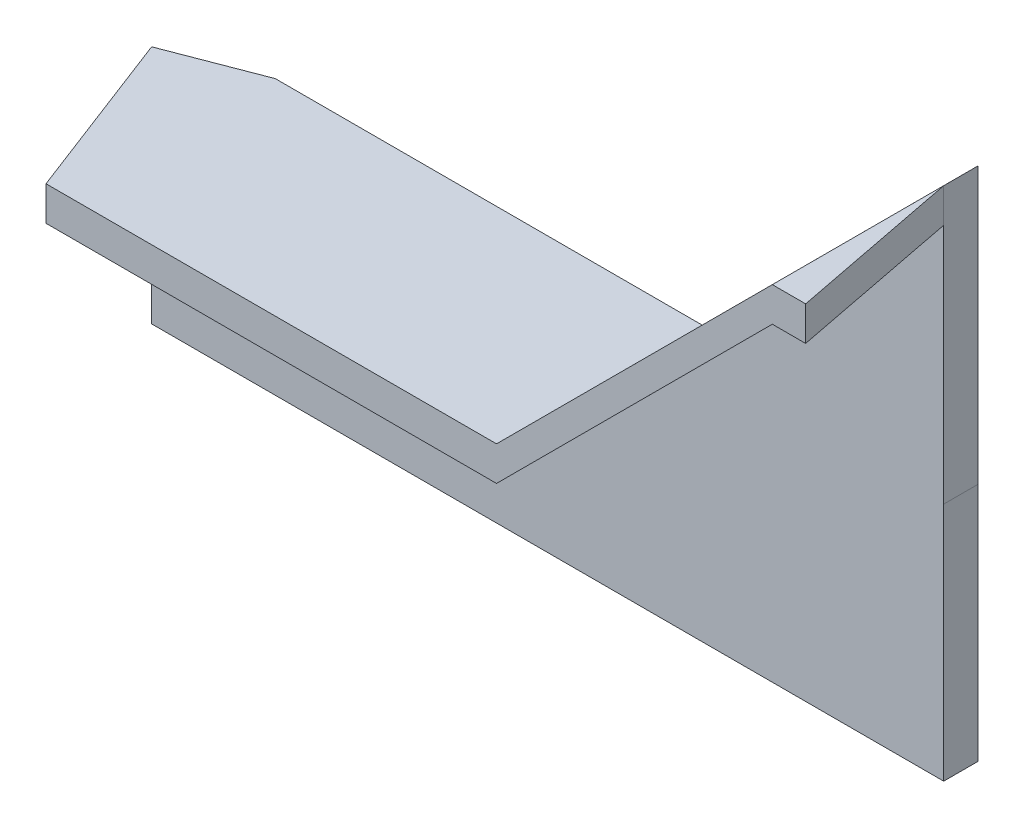
ISO-10303-21;
HEADER;
FILE_DESCRIPTION(('STEP AP214'),'2;1');
FILE_NAME('part.step','',(''),(''),'','','');
FILE_SCHEMA(('AUTOMOTIVE_DESIGN { 1 0 10303 214 1 1 1 1 }'));
ENDSEC;
DATA;
#1=APPLICATION_CONTEXT('core data for automotive mechanical design processes');
#2=APPLICATION_PROTOCOL_DEFINITION('international standard','automotive_design',2000,#1);
#3=PRODUCT_CONTEXT('',#1,'mechanical');
#4=PRODUCT('Part','Part','',(#3));
#5=PRODUCT_RELATED_PRODUCT_CATEGORY('part','',(#4));
#6=PRODUCT_DEFINITION_FORMATION('','',#4);
#7=PRODUCT_DEFINITION_CONTEXT('part definition',#1,'design');
#8=PRODUCT_DEFINITION('design','',#6,#7);
#9=PRODUCT_DEFINITION_SHAPE('','',#8);
#10=(LENGTH_UNIT() NAMED_UNIT(*) SI_UNIT(.MILLI.,.METRE.));
#11=(NAMED_UNIT(*) PLANE_ANGLE_UNIT() SI_UNIT($,.RADIAN.));
#12=(NAMED_UNIT(*) SI_UNIT($,.STERADIAN.) SOLID_ANGLE_UNIT());
#13=UNCERTAINTY_MEASURE_WITH_UNIT(LENGTH_MEASURE(1.E-05),#10,'distance_accuracy_value','');
#14=(GEOMETRIC_REPRESENTATION_CONTEXT(3) GLOBAL_UNCERTAINTY_ASSIGNED_CONTEXT((#13)) GLOBAL_UNIT_ASSIGNED_CONTEXT((#10,
#11,#12)) REPRESENTATION_CONTEXT('',''));
#15=CARTESIAN_POINT('',(0.,0.,0.));
#16=DIRECTION('',(0.,0.,1.));
#17=DIRECTION('',(1.,0.,0.));
#18=AXIS2_PLACEMENT_3D('',#15,#16,#17);
#19=CARTESIAN_POINT('',(0.,0.,2.));
#20=DIRECTION('',(0.,0.,1.));
#21=DIRECTION('',(1.,0.,0.));
#22=AXIS2_PLACEMENT_3D('',#19,#20,#21);
#23=PLANE('',#22);
#24=DIRECTION('',(3.40150407365471E-05,0.999999999421489,0.));
#25=VECTOR('',#24,1.);
#26=CARTESIAN_POINT('',(22.8216855133879,22.4355284552846,2.));
#27=LINE('',#26,#25);
#28=CARTESIAN_POINT('',(22.8211382113821,6.34552845528455,2.));
#29=VERTEX_POINT('',#28);
#30=CARTESIAN_POINT('',(22.8214976653253,20.4355284564416,2.0018487571625));
#31=VERTEX_POINT('',#30);
#32=EDGE_CURVE('E243',#29,#31,#27,.T.);
#33=ORIENTED_EDGE('',*,*,#32,.T.);
#34=DIRECTION('',(0.707105286298341,0.707108276071594,0.));
#35=VECTOR('',#34,1.);
#36=CARTESIAN_POINT('',(6.73168551338772,4.34552845528455,2.));
#37=LINE('',#36,#35);
#38=CARTESIAN_POINT('',(6.73168551338772,4.34552845528455,2.));
#39=VERTEX_POINT('',#38);
#40=EDGE_CURVE('E232',#39,#31,#37,.T.);
#41=ORIENTED_EDGE('',*,*,#40,.F.);
#42=DIRECTION('',(1.,0.,0.));
#43=VECTOR('',#42,1.);
#44=CARTESIAN_POINT('',(-46.1788617886179,4.34552845528455,2.));
#45=LINE('',#44,#43);
#46=CARTESIAN_POINT('',(-23.3890399180056,4.34552845528455,2.));
#47=VERTEX_POINT('',#46);
#48=EDGE_CURVE('E222',#47,#39,#45,.T.);
#49=ORIENTED_EDGE('',*,*,#48,.F.);
#50=DIRECTION('',(0.,-1.,0.));
#51=VECTOR('',#50,1.);
#52=CARTESIAN_POINT('',(-23.3890399180056,0.,2.));
#53=LINE('',#52,#51);
#54=CARTESIAN_POINT('',(-23.3890399180056,-7.65447154471545,2.));
#55=VERTEX_POINT('',#54);
#56=EDGE_CURVE('E229',#47,#55,#53,.T.);
#57=ORIENTED_EDGE('',*,*,#56,.T.);
#58=DIRECTION('',(1.,0.,0.));
#59=VECTOR('',#58,1.);
#60=CARTESIAN_POINT('',(-46.1788617886179,-7.65447154471545,2.));
#61=LINE('',#60,#59);
#62=CARTESIAN_POINT('',(22.8211382113821,-7.65447154471545,2.));
#63=VERTEX_POINT('',#62);
#64=EDGE_CURVE('E227',#55,#63,#61,.T.);
#65=ORIENTED_EDGE('',*,*,#64,.T.);
#66=DIRECTION('',(0.,1.,0.));
#67=VECTOR('',#66,1.);
#68=CARTESIAN_POINT('',(22.8211382113821,6.34552845528455,2.));
#69=LINE('',#68,#67);
#70=EDGE_CURVE('E225',#63,#29,#69,.T.);
#71=ORIENTED_EDGE('',*,*,#70,.T.);
#72=EDGE_LOOP('',(#33,#41,#49,#57,#65,#71));
#73=FACE_BOUND('',#72,.T.);
#74=ADVANCED_FACE('F51',(#73),#23,.T.);
#75=CARTESIAN_POINT('',(-46.1788617886179,6.34552845528455,2.));
#76=DIRECTION('',(0.,-1.,0.));
#77=DIRECTION('',(0.,0.,-1.));
#78=AXIS2_PLACEMENT_3D('',#75,#76,#77);
#79=PLANE('',#78);
#80=DIRECTION('',(0.933580426497204,0.,-0.358367949545294));
#81=VECTOR('',#80,1.);
#82=CARTESIAN_POINT('',(-43.2520199516604,6.34552845528455,9.62468366354648));
#83=LINE('',#82,#81);
#84=CARTESIAN_POINT('',(-23.3890399180056,6.34552845528455,2.));
#85=VERTEX_POINT('',#84);
#86=CARTESIAN_POINT('',(-18.1788617886179,6.34552845528455,0.));
#87=VERTEX_POINT('',#86);
#88=EDGE_CURVE('E209',#85,#87,#83,.T.);
#89=ORIENTED_EDGE('',*,*,#88,.F.);
#90=DIRECTION('',(0.358239373263557,0.,0.933629772149396));
#91=VECTOR('',#90,1.);
#92=CARTESIAN_POINT('',(-26.313781930288,6.34552845528455,-5.6223509259941));
#93=LINE('',#92,#91);
#94=CARTESIAN_POINT('',(-19.551979619052,6.34552845528455,12.));
#95=VERTEX_POINT('',#94);
#96=EDGE_CURVE('E79',#85,#95,#93,.T.);
#97=ORIENTED_EDGE('',*,*,#96,.T.);
#98=DIRECTION('',(-1.,0.,0.));
#99=VECTOR('',#98,1.);
#100=CARTESIAN_POINT('',(6.73168551338772,6.34552845528455,12.));
#101=LINE('',#100,#99);
#102=CARTESIAN_POINT('',(6.73168551338772,6.34552845528455,12.));
#103=VERTEX_POINT('',#102);
#104=EDGE_CURVE('E251',#103,#95,#101,.T.);
#105=ORIENTED_EDGE('',*,*,#104,.F.);
#106=DIRECTION('',(0.,0.,-1.));
#107=VECTOR('',#106,1.);
#108=CARTESIAN_POINT('',(6.73168551338772,6.34552845528455,6.));
#109=LINE('',#108,#107);
#110=CARTESIAN_POINT('',(6.73168551338772,6.34552845528455,0.));
#111=VERTEX_POINT('',#110);
#112=EDGE_CURVE('E220',#103,#111,#109,.T.);
#113=ORIENTED_EDGE('',*,*,#112,.T.);
#114=DIRECTION('',(-1.,0.,0.));
#115=VECTOR('',#114,1.);
#116=CARTESIAN_POINT('',(-46.1788617886179,6.34552845528455,0.));
#117=LINE('',#116,#115);
#118=EDGE_CURVE('E216',#111,#87,#117,.T.);
#119=ORIENTED_EDGE('',*,*,#118,.T.);
#120=EDGE_LOOP('',(#89,#97,#105,#113,#119));
#121=FACE_BOUND('',#120,.T.);
#122=ADVANCED_FACE('F53',(#121),#79,.F.);
#123=CARTESIAN_POINT('',(-46.1788617886179,-7.65447154471545,2.));
#124=DIRECTION('',(0.,1.,0.));
#125=DIRECTION('',(0.,0.,1.));
#126=AXIS2_PLACEMENT_3D('',#123,#124,#125);
#127=PLANE('',#126);
#128=DIRECTION('',(-0.933580426497204,0.,0.358367949545294));
#129=VECTOR('',#128,1.);
#130=CARTESIAN_POINT('',(-43.2520199516604,-7.65447154471545,9.62468366354648));
#131=LINE('',#130,#129);
#132=CARTESIAN_POINT('',(-18.1788617886179,-7.65447154471545,0.));
#133=VERTEX_POINT('',#132);
#134=EDGE_CURVE('E237',#133,#55,#131,.T.);
#135=ORIENTED_EDGE('',*,*,#134,.F.);
#136=DIRECTION('',(1.,0.,0.));
#137=VECTOR('',#136,1.);
#138=CARTESIAN_POINT('',(-46.1788617886179,-7.65447154471545,0.));
#139=LINE('',#138,#137);
#140=CARTESIAN_POINT('',(22.8211382113821,-7.65447154471545,0.));
#141=VERTEX_POINT('',#140);
#142=EDGE_CURVE('E219',#133,#141,#139,.T.);
#143=ORIENTED_EDGE('',*,*,#142,.T.);
#144=DIRECTION('',(0.,0.,-1.));
#145=VECTOR('',#144,1.);
#146=CARTESIAN_POINT('',(22.8211382113821,-7.65447154471545,2.));
#147=LINE('',#146,#145);
#148=EDGE_CURVE('E206',#63,#141,#147,.T.);
#149=ORIENTED_EDGE('',*,*,#148,.F.);
#150=ORIENTED_EDGE('',*,*,#64,.F.);
#151=EDGE_LOOP('',(#135,#143,#149,#150));
#152=FACE_BOUND('',#151,.T.);
#153=ADVANCED_FACE('F305',(#152),#127,.F.);
#154=CARTESIAN_POINT('',(0.,0.,0.));
#155=DIRECTION('',(0.,0.,1.));
#156=DIRECTION('',(1.,0.,0.));
#157=AXIS2_PLACEMENT_3D('',#154,#155,#156);
#158=PLANE('',#157);
#159=DIRECTION('',(0.,-1.,0.));
#160=VECTOR('',#159,1.);
#161=CARTESIAN_POINT('',(-18.1788617886179,26.3455284552846,0.));
#162=LINE('',#161,#160);
#163=EDGE_CURVE('E240',#87,#133,#162,.T.);
#164=ORIENTED_EDGE('',*,*,#163,.F.);
#165=ORIENTED_EDGE('',*,*,#118,.F.);
#166=DIRECTION('',(0.707106781186551,0.707106781186544,0.));
#167=VECTOR('',#166,1.);
#168=CARTESIAN_POINT('',(6.73168551338772,6.34552845528455,0.));
#169=LINE('',#168,#167);
#170=CARTESIAN_POINT('',(22.8216855133879,22.4355284552846,0.));
#171=VERTEX_POINT('',#170);
#172=EDGE_CURVE('E224',#111,#171,#169,.T.);
#173=ORIENTED_EDGE('',*,*,#172,.T.);
#174=DIRECTION('',(-3.40150407365471E-05,-0.999999999421489,0.));
#175=VECTOR('',#174,1.);
#176=CARTESIAN_POINT('',(22.8216855133879,22.4355284552846,0.));
#177=LINE('',#176,#175);
#178=CARTESIAN_POINT('',(22.8211382113821,6.34552845528455,0.));
#179=VERTEX_POINT('',#178);
#180=EDGE_CURVE('E236',#171,#179,#177,.T.);
#181=ORIENTED_EDGE('',*,*,#180,.T.);
#182=DIRECTION('',(0.,1.,0.));
#183=VECTOR('',#182,1.);
#184=CARTESIAN_POINT('',(22.8211382113821,6.34552845528455,0.));
#185=LINE('',#184,#183);
#186=EDGE_CURVE('E210',#141,#179,#185,.T.);
#187=ORIENTED_EDGE('',*,*,#186,.F.);
#188=ORIENTED_EDGE('',*,*,#142,.F.);
#189=EDGE_LOOP('',(#164,#165,#173,#181,#187,#188));
#190=FACE_BOUND('',#189,.T.);
#191=ADVANCED_FACE('F297',(#190),#158,.F.);
#192=CARTESIAN_POINT('',(-46.1788617886179,4.34552845528455,6.));
#193=DIRECTION('',(0.,1.,0.));
#194=DIRECTION('',(0.,0.,1.));
#195=AXIS2_PLACEMENT_3D('',#192,#193,#194);
#196=PLANE('',#195);
#197=DIRECTION('',(1.,0.,0.));
#198=VECTOR('',#197,1.);
#199=CARTESIAN_POINT('',(-21.8542157984241,4.34552845528455,12.));
#200=LINE('',#199,#198);
#201=CARTESIAN_POINT('',(-19.551979619052,4.34552845528455,12.));
#202=VERTEX_POINT('',#201);
#203=CARTESIAN_POINT('',(6.73168551338772,4.34552845528455,12.));
#204=VERTEX_POINT('',#203);
#205=EDGE_CURVE('E248',#202,#204,#200,.T.);
#206=ORIENTED_EDGE('',*,*,#205,.F.);
#207=DIRECTION('',(0.358239373263557,0.,0.933629772149396));
#208=VECTOR('',#207,1.);
#209=CARTESIAN_POINT('',(-21.8542157984241,4.34552845528455,6.));
#210=LINE('',#209,#208);
#211=EDGE_CURVE('E205',#47,#202,#210,.T.);
#212=ORIENTED_EDGE('',*,*,#211,.F.);
#213=ORIENTED_EDGE('',*,*,#48,.T.);
#214=DIRECTION('',(0.,0.,-1.));
#215=VECTOR('',#214,1.);
#216=CARTESIAN_POINT('',(6.73168551338772,4.34552845528455,6.));
#217=LINE('',#216,#215);
#218=EDGE_CURVE('E214',#204,#39,#217,.T.);
#219=ORIENTED_EDGE('',*,*,#218,.F.);
#220=EDGE_LOOP('',(#206,#212,#213,#219));
#221=FACE_BOUND('',#220,.T.);
#222=ADVANCED_FACE('F295',(#221),#196,.F.);
#223=CARTESIAN_POINT('',(22.8211382113821,6.34552845528455,2.));
#224=DIRECTION('',(-1.,0.,0.));
#225=DIRECTION('',(0.,0.,1.));
#226=AXIS2_PLACEMENT_3D('',#223,#224,#225);
#227=PLANE('',#226);
#228=ORIENTED_EDGE('',*,*,#186,.T.);
#229=DIRECTION('',(0.,0.,-1.));
#230=VECTOR('',#229,1.);
#231=CARTESIAN_POINT('',(22.8211382113821,6.34552845528455,2.));
#232=LINE('',#231,#230);
#233=EDGE_CURVE('E211',#29,#179,#232,.T.);
#234=ORIENTED_EDGE('',*,*,#233,.F.);
#235=ORIENTED_EDGE('',*,*,#70,.F.);
#236=ORIENTED_EDGE('',*,*,#148,.T.);
#237=EDGE_LOOP('',(#228,#234,#235,#236));
#238=FACE_BOUND('',#237,.T.);
#239=ADVANCED_FACE('F293',(#238),#227,.F.);
#240=CARTESIAN_POINT('',(-18.1788617886179,26.3455284552846,0.));
#241=DIRECTION('',(-0.358367949545294,0.,-0.933580426497204));
#242=DIRECTION('',(-0.933580426497204,0.,0.358367949545294));
#243=AXIS2_PLACEMENT_3D('',#240,#241,#242);
#244=PLANE('',#243);
#245=DIRECTION('',(0.,-1.,0.));
#246=VECTOR('',#245,1.);
#247=CARTESIAN_POINT('',(-23.3890399180056,26.3455284552846,2.));
#248=LINE('',#247,#246);
#249=EDGE_CURVE('E62',#85,#47,#248,.T.);
#250=ORIENTED_EDGE('',*,*,#249,.F.);
#251=ORIENTED_EDGE('',*,*,#88,.T.);
#252=ORIENTED_EDGE('',*,*,#163,.T.);
#253=ORIENTED_EDGE('',*,*,#134,.T.);
#254=ORIENTED_EDGE('',*,*,#56,.F.);
#255=EDGE_LOOP('',(#250,#251,#252,#253,#254));
#256=FACE_BOUND('',#255,.T.);
#257=ADVANCED_FACE('F280',(#256),#244,.T.);
#258=CARTESIAN_POINT('',(6.73168551338772,6.34552845528455,-22.7546962185832));
#259=DIRECTION('',(-0.707106781186544,0.707106781186551,0.));
#260=DIRECTION('',(-0.707106781186551,-0.707106781186544,0.));
#261=AXIS2_PLACEMENT_3D('',#258,#259,#260);
#262=PLANE('',#261);
#263=CARTESIAN_POINT('',(22.8216855133879,22.4355284564416,2.00281490444715));
#264=DIRECTION('',(0.,0.,1.));
#265=VECTOR('',#264,1.);
#266=LINE('',#263,#265);
#267=CARTESIAN_POINT('',(22.8216854947647,22.4349809559129,2.00281480866327));
#268=VERTEX_POINT('',#267);
#269=CARTESIAN_POINT('',(22.8216514983471,22.4354944402438,12.));
#270=VERTEX_POINT('',#269);
#271=EDGE_CURVE('E69',#268,#270,#266,.T.);
#272=ORIENTED_EDGE('',*,*,#271,.F.);
#273=DIRECTION('',(0.,0.,1.));
#274=VECTOR('',#273,1.);
#275=CARTESIAN_POINT('',(22.8216855133879,22.4355284552846,-22.7546962185832));
#276=LINE('',#275,#274);
#277=EDGE_CURVE('E239',#171,#268,#276,.T.);
#278=ORIENTED_EDGE('',*,*,#277,.F.);
#279=ORIENTED_EDGE('',*,*,#172,.F.);
#280=ORIENTED_EDGE('',*,*,#112,.F.);
#281=DIRECTION('',(-0.707106781186551,-0.707106781186544,0.));
#282=VECTOR('',#281,1.);
#283=CARTESIAN_POINT('',(22.8216855133879,22.4355284552846,12.));
#284=LINE('',#283,#282);
#285=EDGE_CURVE('E91',#270,#103,#284,.T.);
#286=ORIENTED_EDGE('',*,*,#285,.F.);
#287=EDGE_LOOP('',(#272,#278,#279,#280,#286));
#288=FACE_BOUND('',#287,.T.);
#289=ADVANCED_FACE('F270',(#288),#262,.T.);
#290=CARTESIAN_POINT('',(22.8216855133879,22.4355284552846,-22.7546962185832));
#291=DIRECTION('',(0.999999999421488,-3.40150407365471E-05,0.));
#292=DIRECTION('',(3.40150407365471E-05,0.999999999421489,0.));
#293=AXIS2_PLACEMENT_3D('',#290,#291,#292);
#294=PLANE('',#293);
#295=CARTESIAN_POINT('',(22.8216174833064,20.4355284564416,2.00246500955003));
#296=DIRECTION('',(3.4015040214606E-05,0.999999984118184,0.000174947445753188));
#297=VECTOR('',#296,1.);
#298=LINE('',#295,#297);
#299=EDGE_CURVE('E12',#31,#268,#298,.T.);
#300=ORIENTED_EDGE('',*,*,#299,.F.);
#301=ORIENTED_EDGE('',*,*,#32,.F.);
#302=ORIENTED_EDGE('',*,*,#233,.T.);
#303=ORIENTED_EDGE('',*,*,#180,.F.);
#304=ORIENTED_EDGE('',*,*,#277,.T.);
#305=EDGE_LOOP('',(#300,#301,#302,#303,#304));
#306=FACE_BOUND('',#305,.T.);
#307=ADVANCED_FACE('F279',(#306),#294,.T.);
#308=CARTESIAN_POINT('',(6.73168551338772,4.34552845528455,30.2102498954473));
#309=DIRECTION('',(-0.707108276071594,0.707105286298341,0.));
#310=DIRECTION('',(-0.707105286298341,-0.707108276071594,0.));
#311=AXIS2_PLACEMENT_3D('',#308,#309,#310);
#312=PLANE('',#311);
#313=CARTESIAN_POINT('',(22.8216174833064,20.4355284564416,12.));
#314=DIRECTION('',(0.,0.,-1.));
#315=VECTOR('',#314,1.);
#316=LINE('',#313,#315);
#317=CARTESIAN_POINT('',(22.8216174833064,20.4355284564416,12.));
#318=VERTEX_POINT('',#317);
#319=EDGE_CURVE('E215',#318,#31,#316,.T.);
#320=ORIENTED_EDGE('',*,*,#319,.F.);
#321=DIRECTION('',(0.707105286298341,0.707108276071594,0.));
#322=VECTOR('',#321,1.);
#323=CARTESIAN_POINT('',(6.73168551338772,4.34552845528455,12.));
#324=LINE('',#323,#322);
#325=EDGE_CURVE('E250',#204,#318,#324,.T.);
#326=ORIENTED_EDGE('',*,*,#325,.F.);
#327=ORIENTED_EDGE('',*,*,#218,.T.);
#328=ORIENTED_EDGE('',*,*,#40,.T.);
#329=EDGE_LOOP('',(#320,#326,#327,#328));
#330=FACE_BOUND('',#329,.T.);
#331=ADVANCED_FACE('F283',(#330),#312,.F.);
#332=CARTESIAN_POINT('',(0.,0.,12.));
#333=DIRECTION('',(0.,0.,1.));
#334=DIRECTION('',(1.,0.,0.));
#335=AXIS2_PLACEMENT_3D('',#332,#333,#334);
#336=PLANE('',#335);
#337=ORIENTED_EDGE('',*,*,#325,.T.);
#338=DIRECTION('',(-1.,0.,0.));
#339=VECTOR('',#338,1.);
#340=CARTESIAN_POINT('',(22.8216174833064,20.4355284564416,12.));
#341=LINE('',#340,#339);
#342=CARTESIAN_POINT('',(24.765438687986,20.4355284564416,12.));
#343=VERTEX_POINT('',#342);
#344=EDGE_CURVE('E155',#343,#318,#341,.T.);
#345=ORIENTED_EDGE('',*,*,#344,.F.);
#346=DIRECTION('',(0.,-1.,0.));
#347=VECTOR('',#346,1.);
#348=CARTESIAN_POINT('',(24.765438687986,22.4355284564416,12.));
#349=LINE('',#348,#347);
#350=CARTESIAN_POINT('',(24.765438687986,22.4355284564416,12.));
#351=VERTEX_POINT('',#350);
#352=EDGE_CURVE('E149',#351,#343,#349,.T.);
#353=ORIENTED_EDGE('',*,*,#352,.F.);
#354=DIRECTION('',(-1.,0.,0.));
#355=VECTOR('',#354,1.);
#356=CARTESIAN_POINT('',(22.8216174833064,22.4355284564416,12.));
#357=LINE('',#356,#355);
#358=EDGE_CURVE('E154',#351,#270,#357,.T.);
#359=ORIENTED_EDGE('',*,*,#358,.T.);
#360=ORIENTED_EDGE('',*,*,#285,.T.);
#361=ORIENTED_EDGE('',*,*,#104,.T.);
#362=DIRECTION('',(0.,1.,0.));
#363=VECTOR('',#362,1.);
#364=CARTESIAN_POINT('',(-19.551979619052,0.,12.));
#365=LINE('',#364,#363);
#366=EDGE_CURVE('E203',#202,#95,#365,.T.);
#367=ORIENTED_EDGE('',*,*,#366,.F.);
#368=ORIENTED_EDGE('',*,*,#205,.T.);
#369=EDGE_LOOP('',(#337,#345,#353,#359,#360,#361,#367,#368));
#370=FACE_BOUND('',#369,.T.);
#371=ADVANCED_FACE('F158',(#370),#336,.T.);
#372=CARTESIAN_POINT('',(-21.8542157984241,10.3455284552845,6.));
#373=DIRECTION('',(0.933629772149396,0.,-0.358239373263557));
#374=DIRECTION('',(-0.358239373263557,0.,-0.933629772149396));
#375=AXIS2_PLACEMENT_3D('',#372,#373,#374);
#376=PLANE('',#375);
#377=ORIENTED_EDGE('',*,*,#366,.T.);
#378=ORIENTED_EDGE('',*,*,#96,.F.);
#379=ORIENTED_EDGE('',*,*,#249,.T.);
#380=ORIENTED_EDGE('',*,*,#211,.T.);
#381=EDGE_LOOP('',(#377,#378,#379,#380));
#382=FACE_BOUND('',#381,.T.);
#383=ADVANCED_FACE('F186',(#382),#376,.F.);
#384=CARTESIAN_POINT('',(0.,20.4355284564416,0.));
#385=DIRECTION('',(0.,1.,0.));
#386=DIRECTION('',(0.,0.,1.));
#387=AXIS2_PLACEMENT_3D('',#384,#385,#386);
#388=PLANE('',#387);
#389=ORIENTED_EDGE('',*,*,#344,.T.);
#390=ORIENTED_EDGE('',*,*,#319,.T.);
#391=DIRECTION('',(0.190856041792253,0.,0.981618037380831));
#392=VECTOR('',#391,1.);
#393=CARTESIAN_POINT('',(24.765438687986,20.4355284564416,12.));
#394=LINE('',#393,#392);
#395=EDGE_CURVE('E347',#31,#343,#394,.T.);
#396=ORIENTED_EDGE('',*,*,#395,.T.);
#397=EDGE_LOOP('',(#389,#390,#396));
#398=FACE_BOUND('',#397,.T.);
#399=ADVANCED_FACE('F182',(#398),#388,.F.);
#400=CARTESIAN_POINT('',(24.765438687986,22.4355284564416,12.));
#401=DIRECTION('',(0.981618037380831,0.,-0.190856041792253));
#402=DIRECTION('',(-0.190856041792253,0.,-0.981618037380831));
#403=AXIS2_PLACEMENT_3D('',#400,#401,#402);
#404=PLANE('',#403);
#405=ORIENTED_EDGE('',*,*,#395,.F.);
#406=ORIENTED_EDGE('',*,*,#299,.T.);
#407=DIRECTION('',(0.190856041792253,0.,0.981618037380831));
#408=VECTOR('',#407,1.);
#409=CARTESIAN_POINT('',(24.765438687986,22.4355284564416,12.));
#410=LINE('',#409,#408);
#411=EDGE_CURVE('E145',#268,#351,#410,.T.);
#412=ORIENTED_EDGE('',*,*,#411,.T.);
#413=ORIENTED_EDGE('',*,*,#352,.T.);
#414=EDGE_LOOP('',(#405,#406,#412,#413));
#415=FACE_BOUND('',#414,.T.);
#416=ADVANCED_FACE('F148',(#415),#404,.T.);
#417=CARTESIAN_POINT('',(0.,22.4355284564416,0.));
#418=DIRECTION('',(0.,1.,0.));
#419=DIRECTION('',(0.,0.,1.));
#420=AXIS2_PLACEMENT_3D('',#417,#418,#419);
#421=PLANE('',#420);
#422=ORIENTED_EDGE('',*,*,#411,.F.);
#423=ORIENTED_EDGE('',*,*,#271,.T.);
#424=ORIENTED_EDGE('',*,*,#358,.F.);
#425=EDGE_LOOP('',(#422,#423,#424));
#426=FACE_BOUND('',#425,.T.);
#427=ADVANCED_FACE('F161',(#426),#421,.T.);
#428=CLOSED_SHELL('',(#74,#122,#153,#191,#222,#239,#257,#289,#307,#331,#371,#383,#399,#416,#427));
#429=MANIFOLD_SOLID_BREP('B2',#428);
#430=CARTESIAN_POINT('',(-23.3895907696901,4.34552845528455,2.00021145215033));
#431=DIRECTION('',(0.933580426497205,0.,-0.358367949545291));
#432=DIRECTION('',(-0.358367949545291,0.,-0.933580426497205));
#433=AXIS2_PLACEMENT_3D('',#430,#431,#432);
#434=PLANE('',#433);
#435=DIRECTION('',(-0.358367949545291,0.,-0.933580426497205));
#436=VECTOR('',#435,1.);
#437=CARTESIAN_POINT('',(-23.3895907696901,4.34552845528455,2.00021145215033));
#438=LINE('',#437,#436);
#439=CARTESIAN_POINT('',(-23.3886188599425,4.34552845528455,2.00274336360567));
#440=VERTEX_POINT('',#439);
#441=CARTESIAN_POINT('',(-23.3895907696901,4.34552845528455,2.00021145215033));
#442=VERTEX_POINT('',#441);
#443=EDGE_CURVE('E541',#440,#442,#438,.T.);
#444=ORIENTED_EDGE('',*,*,#443,.F.);
#445=DIRECTION('',(0.,1.,0.));
#446=VECTOR('',#445,1.);
#447=CARTESIAN_POINT('',(-23.3886188599425,4.34552845528455,2.00274336360567));
#448=LINE('',#447,#446);
#449=CARTESIAN_POINT('',(-23.3886188599425,6.34552845528455,2.00274336360567));
#450=VERTEX_POINT('',#449);
#451=EDGE_CURVE('E529',#440,#450,#448,.T.);
#452=ORIENTED_EDGE('',*,*,#451,.T.);
#453=DIRECTION('',(-0.358367949545291,0.,-0.933580426497205));
#454=VECTOR('',#453,1.);
#455=CARTESIAN_POINT('',(-23.3895907696901,6.34552845528455,2.00021145215033));
#456=LINE('',#455,#454);
#457=CARTESIAN_POINT('',(-23.3895907696901,6.34552845528455,2.00021145215033));
#458=VERTEX_POINT('',#457);
#459=EDGE_CURVE('E546',#450,#458,#456,.T.);
#460=ORIENTED_EDGE('',*,*,#459,.T.);
#461=DIRECTION('',(0.,1.,0.));
#462=VECTOR('',#461,1.);
#463=CARTESIAN_POINT('',(-23.3895907696901,4.34552845528455,2.00021145215033));
#464=LINE('',#463,#462);
#465=EDGE_CURVE('E543',#442,#458,#464,.T.);
#466=ORIENTED_EDGE('',*,*,#465,.F.);
#467=EDGE_LOOP('',(#444,#452,#460,#466));
#468=FACE_BOUND('',#467,.T.);
#469=ADVANCED_FACE('F496',(#468),#434,.F.);
#470=CARTESIAN_POINT('',(-18.1788617886179,26.3455284552846,0.));
#471=DIRECTION('',(-0.358367949545294,0.,-0.933580426497204));
#472=DIRECTION('',(-0.933580426497204,0.,0.358367949545294));
#473=AXIS2_PLACEMENT_3D('',#470,#471,#472);
#474=PLANE('',#473);
#475=DIRECTION('',(0.933580426497204,0.,-0.358367949545294));
#476=VECTOR('',#475,1.);
#477=CARTESIAN_POINT('',(-43.2520199516604,6.34552845528455,9.62468366354648));
#478=LINE('',#477,#476);
#479=CARTESIAN_POINT('',(-23.3890399180056,6.34552845528455,2.));
#480=VERTEX_POINT('',#479);
#481=EDGE_CURVE('E49',#458,#480,#478,.T.);
#482=ORIENTED_EDGE('',*,*,#481,.T.);
#483=DIRECTION('',(0.,-1.,0.));
#484=VECTOR('',#483,1.);
#485=CARTESIAN_POINT('',(-23.3890399180056,10.3455284552845,2.));
#486=LINE('',#485,#484);
#487=CARTESIAN_POINT('',(-23.3890399180056,4.34552845528455,2.));
#488=VERTEX_POINT('',#487);
#489=EDGE_CURVE('E511',#480,#488,#486,.T.);
#490=ORIENTED_EDGE('',*,*,#489,.T.);
#491=DIRECTION('',(-0.933580426497204,0.,0.358367949545294));
#492=VECTOR('',#491,1.);
#493=CARTESIAN_POINT('',(-44.5902811643781,4.34552845528455,10.1383940125917));
#494=LINE('',#493,#492);
#495=EDGE_CURVE('E504',#488,#442,#494,.T.);
#496=ORIENTED_EDGE('',*,*,#495,.T.);
#497=ORIENTED_EDGE('',*,*,#465,.T.);
#498=EDGE_LOOP('',(#482,#490,#496,#497));
#499=FACE_BOUND('',#498,.T.);
#500=ADVANCED_FACE('F536',(#499),#474,.T.);
#501=CARTESIAN_POINT('',(-46.1788617886179,4.34552845528455,6.));
#502=DIRECTION('',(0.,1.,0.));
#503=DIRECTION('',(0.,0.,1.));
#504=AXIS2_PLACEMENT_3D('',#501,#502,#503);
#505=PLANE('',#504);
#506=ORIENTED_EDGE('',*,*,#495,.F.);
#507=DIRECTION('',(-0.151705955708931,0.,-0.988425668931377));
#508=VECTOR('',#507,1.);
#509=CARTESIAN_POINT('',(-21.8542157984241,4.34552845528455,12.));
#510=LINE('',#509,#508);
#511=EDGE_CURVE('E527',#440,#488,#510,.T.);
#512=ORIENTED_EDGE('',*,*,#511,.F.);
#513=ORIENTED_EDGE('',*,*,#443,.T.);
#514=EDGE_LOOP('',(#506,#512,#513));
#515=FACE_BOUND('',#514,.T.);
#516=ADVANCED_FACE('F540',(#515),#505,.F.);
#517=CARTESIAN_POINT('',(-46.1788617886179,6.34552845528455,2.));
#518=DIRECTION('',(0.,-1.,0.));
#519=DIRECTION('',(0.,0.,-1.));
#520=AXIS2_PLACEMENT_3D('',#517,#518,#519);
#521=PLANE('',#520);
#522=ORIENTED_EDGE('',*,*,#459,.F.);
#523=DIRECTION('',(-0.151705955708931,0.,-0.988425668931377));
#524=VECTOR('',#523,1.);
#525=CARTESIAN_POINT('',(-23.9135407629861,6.34552845528455,-1.41733517403637));
#526=LINE('',#525,#524);
#527=EDGE_CURVE('E515',#450,#480,#526,.T.);
#528=ORIENTED_EDGE('',*,*,#527,.T.);
#529=ORIENTED_EDGE('',*,*,#481,.F.);
#530=EDGE_LOOP('',(#522,#528,#529));
#531=FACE_BOUND('',#530,.T.);
#532=ADVANCED_FACE('F498',(#531),#521,.F.);
#533=CARTESIAN_POINT('',(-21.8542157984241,10.3455284552845,12.));
#534=DIRECTION('',(-0.988425668931377,0.,0.151705955708931));
#535=DIRECTION('',(0.151705955708931,0.,0.988425668931377));
#536=AXIS2_PLACEMENT_3D('',#533,#534,#535);
#537=PLANE('',#536);
#538=ORIENTED_EDGE('',*,*,#451,.F.);
#539=ORIENTED_EDGE('',*,*,#511,.T.);
#540=ORIENTED_EDGE('',*,*,#489,.F.);
#541=ORIENTED_EDGE('',*,*,#527,.F.);
#542=EDGE_LOOP('',(#538,#539,#540,#541));
#543=FACE_BOUND('',#542,.T.);
#544=ADVANCED_FACE('F528',(#543),#537,.F.);
#545=CLOSED_SHELL('',(#469,#500,#516,#532,#544));
#546=MANIFOLD_SOLID_BREP('B6',#545);
#547=ADVANCED_BREP_SHAPE_REPRESENTATION('',(#18,#429,#546),#14);
#548=SHAPE_DEFINITION_REPRESENTATION(#9,#547);
ENDSEC;
END-ISO-10303-21;
